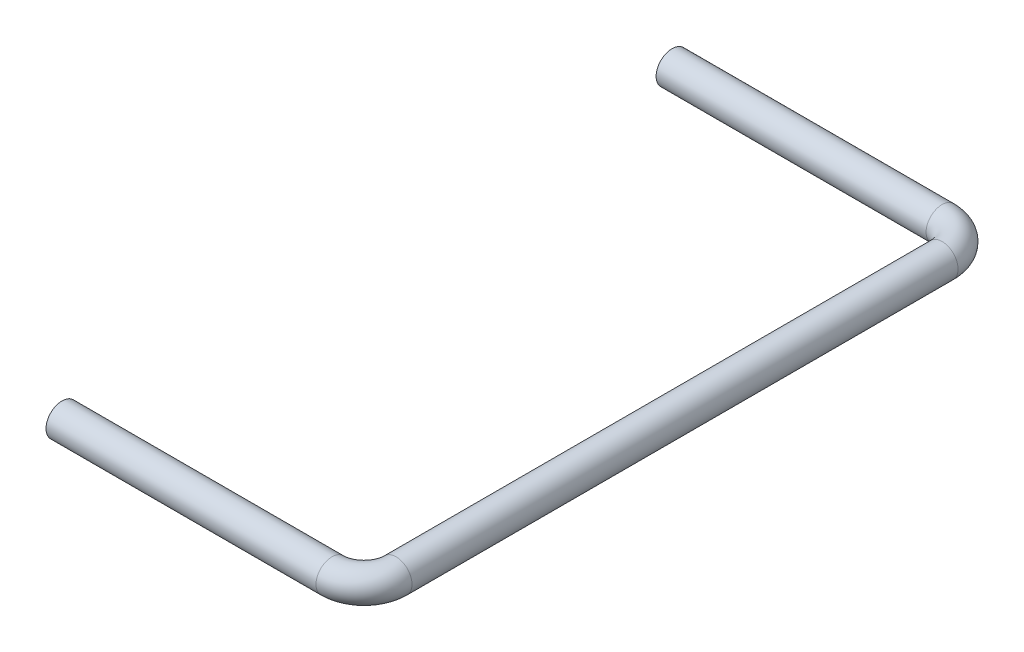
ISO-10303-21;
HEADER;
FILE_DESCRIPTION(('STEP AP214'),'2;1');
FILE_NAME('part.step','',(''),(''),'','','');
FILE_SCHEMA(('AUTOMOTIVE_DESIGN { 1 0 10303 214 1 1 1 1 }'));
ENDSEC;
DATA;
#1=APPLICATION_CONTEXT('core data for automotive mechanical design processes');
#2=APPLICATION_PROTOCOL_DEFINITION('international standard','automotive_design',2000,#1);
#3=PRODUCT_CONTEXT('',#1,'mechanical');
#4=PRODUCT('Part','Part','',(#3));
#5=PRODUCT_RELATED_PRODUCT_CATEGORY('part','',(#4));
#6=PRODUCT_DEFINITION_FORMATION('','',#4);
#7=PRODUCT_DEFINITION_CONTEXT('part definition',#1,'design');
#8=PRODUCT_DEFINITION('design','',#6,#7);
#9=PRODUCT_DEFINITION_SHAPE('','',#8);
#10=(LENGTH_UNIT() NAMED_UNIT(*) SI_UNIT(.MILLI.,.METRE.));
#11=(NAMED_UNIT(*) PLANE_ANGLE_UNIT() SI_UNIT($,.RADIAN.));
#12=(NAMED_UNIT(*) SI_UNIT($,.STERADIAN.) SOLID_ANGLE_UNIT());
#13=UNCERTAINTY_MEASURE_WITH_UNIT(LENGTH_MEASURE(1.E-05),#10,'distance_accuracy_value','');
#14=(GEOMETRIC_REPRESENTATION_CONTEXT(3) GLOBAL_UNCERTAINTY_ASSIGNED_CONTEXT((#13)) GLOBAL_UNIT_ASSIGNED_CONTEXT((#10,
#11,#12)) REPRESENTATION_CONTEXT('',''));
#15=CARTESIAN_POINT('',(0.,0.,0.));
#16=DIRECTION('',(0.,0.,1.));
#17=DIRECTION('',(1.,0.,0.));
#18=AXIS2_PLACEMENT_3D('',#15,#16,#17);
#19=CARTESIAN_POINT('',(-3.04336293856408,0.,-7.61999999999999));
#20=DIRECTION('',(1.,0.,0.));
#21=DIRECTION('',(0.,0.,-1.));
#22=AXIS2_PLACEMENT_3D('',#19,#20,#21);
#23=PLANE('',#22);
#24=CARTESIAN_POINT('',(-3.04336293856409,0.,-7.61999999999999));
#25=DIRECTION('',(1.,0.,0.));
#26=DIRECTION('',(0.,0.,-1.));
#27=AXIS2_PLACEMENT_3D('',#24,#25,#26);
#28=CIRCLE('',#27,0.4);
#29=CARTESIAN_POINT('',(-3.04336293856409,0.,-8.01999999999999));
#30=VERTEX_POINT('',#29);
#31=EDGE_CURVE('E17',#30,#30,#28,.T.);
#32=ORIENTED_EDGE('',*,*,#31,.F.);
#33=EDGE_LOOP('',(#32));
#34=FACE_BOUND('',#33,.T.);
#35=ADVANCED_FACE('F14',(#34),#23,.F.);
#36=CARTESIAN_POINT('',(-3.04336293856408,0.,7.61999999999999));
#37=DIRECTION('',(-1.,0.,0.));
#38=DIRECTION('',(0.,0.,1.));
#39=AXIS2_PLACEMENT_3D('',#36,#37,#38);
#40=PLANE('',#39);
#41=CARTESIAN_POINT('',(-3.04336293856409,0.,7.61999999999999));
#42=DIRECTION('',(-1.,0.,0.));
#43=DIRECTION('',(0.,0.,1.));
#44=AXIS2_PLACEMENT_3D('',#41,#42,#43);
#45=CIRCLE('',#44,0.4);
#46=CARTESIAN_POINT('',(-3.04336293856409,0.,8.01999999999999));
#47=VERTEX_POINT('',#46);
#48=EDGE_CURVE('E56',#47,#47,#45,.F.);
#49=ORIENTED_EDGE('',*,*,#48,.F.);
#50=EDGE_LOOP('',(#49));
#51=FACE_BOUND('',#50,.T.);
#52=ADVANCED_FACE('F67',(#51),#40,.T.);
#53=CARTESIAN_POINT('',(11.7766370614359,0.,-7.62000000000001));
#54=DIRECTION('',(1.,0.,0.));
#55=DIRECTION('',(0.,0.,-1.));
#56=AXIS2_PLACEMENT_3D('',#53,#54,#55);
#57=CYLINDRICAL_SURFACE('',#56,0.4);
#58=CARTESIAN_POINT('',(3.7,0.,-7.62));
#59=DIRECTION('',(-1.,0.,0.));
#60=DIRECTION('',(0.,0.,-1.));
#61=AXIS2_PLACEMENT_3D('',#58,#59,#60);
#62=CIRCLE('',#61,0.399999999999999);
#63=CARTESIAN_POINT('',(3.7,0.,-8.02));
#64=VERTEX_POINT('',#63);
#65=EDGE_CURVE('E53',#64,#64,#62,.F.);
#66=ORIENTED_EDGE('',*,*,#65,.F.);
#67=EDGE_LOOP('',(#66));
#68=FACE_BOUND('',#67,.T.);
#69=ORIENTED_EDGE('',*,*,#31,.T.);
#70=EDGE_LOOP('',(#69));
#71=FACE_BOUND('',#70,.T.);
#72=ADVANCED_FACE('F64',(#68,#71),#57,.T.);
#73=CARTESIAN_POINT('',(11.7766370614359,0.,7.62000000000001));
#74=DIRECTION('',(-1.,0.,0.));
#75=DIRECTION('',(0.,0.,1.));
#76=AXIS2_PLACEMENT_3D('',#73,#74,#75);
#77=CYLINDRICAL_SURFACE('',#76,0.4);
#78=CARTESIAN_POINT('',(3.7,0.,7.62));
#79=DIRECTION('',(-1.,0.,0.));
#80=DIRECTION('',(0.,0.,1.));
#81=AXIS2_PLACEMENT_3D('',#78,#79,#80);
#82=CIRCLE('',#81,0.399999999999999);
#83=CARTESIAN_POINT('',(3.7,0.,8.02));
#84=VERTEX_POINT('',#83);
#85=EDGE_CURVE('E26',#84,#84,#82,.F.);
#86=ORIENTED_EDGE('',*,*,#85,.F.);
#87=EDGE_LOOP('',(#86));
#88=FACE_BOUND('',#87,.T.);
#89=ORIENTED_EDGE('',*,*,#48,.T.);
#90=EDGE_LOOP('',(#89));
#91=FACE_BOUND('',#90,.T.);
#92=ADVANCED_FACE('F47',(#88,#91),#77,.T.);
#93=CARTESIAN_POINT('',(3.7,0.,-6.82));
#94=DIRECTION('',(0.,1.,0.));
#95=DIRECTION('',(0.,0.,1.));
#96=AXIS2_PLACEMENT_3D('',#93,#94,#95);
#97=TOROIDAL_SURFACE('',#96,0.8,0.399999999999999);
#98=CARTESIAN_POINT('',(4.5,0.,-6.82));
#99=DIRECTION('',(0.,0.,1.));
#100=DIRECTION('',(1.,0.,0.));
#101=AXIS2_PLACEMENT_3D('',#98,#99,#100);
#102=CIRCLE('',#101,0.4);
#103=CARTESIAN_POINT('',(4.9,0.,-6.82));
#104=VERTEX_POINT('',#103);
#105=EDGE_CURVE('E21',#104,#104,#102,.T.);
#106=ORIENTED_EDGE('',*,*,#105,.F.);
#107=EDGE_LOOP('',(#106));
#108=FACE_BOUND('',#107,.T.);
#109=ORIENTED_EDGE('',*,*,#65,.T.);
#110=EDGE_LOOP('',(#109));
#111=FACE_BOUND('',#110,.T.);
#112=ADVANCED_FACE('F42',(#108,#111),#97,.T.);
#113=CARTESIAN_POINT('',(3.7,0.,6.82));
#114=DIRECTION('',(0.,-1.,0.));
#115=DIRECTION('',(0.,0.,-1.));
#116=AXIS2_PLACEMENT_3D('',#113,#114,#115);
#117=TOROIDAL_SURFACE('',#116,0.8,0.399999999999999);
#118=CARTESIAN_POINT('',(4.5,0.,6.82));
#119=DIRECTION('',(0.,0.,1.));
#120=DIRECTION('',(1.,0.,0.));
#121=AXIS2_PLACEMENT_3D('',#118,#119,#120);
#122=CIRCLE('',#121,0.4);
#123=CARTESIAN_POINT('',(4.9,0.,6.82));
#124=VERTEX_POINT('',#123);
#125=EDGE_CURVE('E9',#124,#124,#122,.F.);
#126=ORIENTED_EDGE('',*,*,#125,.F.);
#127=EDGE_LOOP('',(#126));
#128=FACE_BOUND('',#127,.T.);
#129=ORIENTED_EDGE('',*,*,#85,.T.);
#130=EDGE_LOOP('',(#129));
#131=FACE_BOUND('',#130,.T.);
#132=ADVANCED_FACE('F37',(#128,#131),#117,.T.);
#133=CARTESIAN_POINT('',(4.5,0.,0.));
#134=DIRECTION('',(0.,0.,1.));
#135=DIRECTION('',(1.,0.,0.));
#136=AXIS2_PLACEMENT_3D('',#133,#134,#135);
#137=CYLINDRICAL_SURFACE('',#136,0.4);
#138=ORIENTED_EDGE('',*,*,#125,.T.);
#139=EDGE_LOOP('',(#138));
#140=FACE_BOUND('',#139,.T.);
#141=ORIENTED_EDGE('',*,*,#105,.T.);
#142=EDGE_LOOP('',(#141));
#143=FACE_BOUND('',#142,.T.);
#144=ADVANCED_FACE('F41',(#140,#143),#137,.T.);
#145=CLOSED_SHELL('',(#35,#52,#72,#92,#112,#132,#144));
#146=MANIFOLD_SOLID_BREP('B1',#145);
#147=ADVANCED_BREP_SHAPE_REPRESENTATION('',(#18,#146),#14);
#148=SHAPE_DEFINITION_REPRESENTATION(#9,#147);
ENDSEC;
END-ISO-10303-21;
